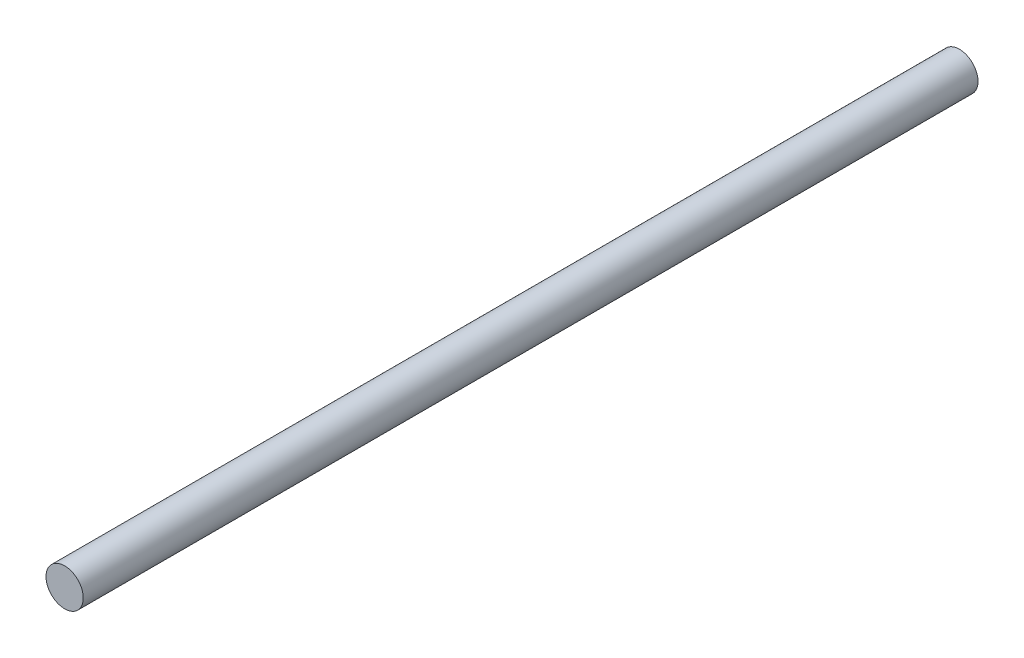
ISO-10303-21;
HEADER;
FILE_DESCRIPTION(('STEP AP214'),'2;1');
FILE_NAME('part.step','',(''),(''),'','','');
FILE_SCHEMA(('AUTOMOTIVE_DESIGN { 1 0 10303 214 1 1 1 1 }'));
ENDSEC;
DATA;
#1=APPLICATION_CONTEXT('core data for automotive mechanical design processes');
#2=APPLICATION_PROTOCOL_DEFINITION('international standard','automotive_design',2000,#1);
#3=PRODUCT_CONTEXT('',#1,'mechanical');
#4=PRODUCT('Part','Part','',(#3));
#5=PRODUCT_RELATED_PRODUCT_CATEGORY('part','',(#4));
#6=PRODUCT_DEFINITION_FORMATION('','',#4);
#7=PRODUCT_DEFINITION_CONTEXT('part definition',#1,'design');
#8=PRODUCT_DEFINITION('design','',#6,#7);
#9=PRODUCT_DEFINITION_SHAPE('','',#8);
#10=(LENGTH_UNIT() NAMED_UNIT(*) SI_UNIT(.MILLI.,.METRE.));
#11=(NAMED_UNIT(*) PLANE_ANGLE_UNIT() SI_UNIT($,.RADIAN.));
#12=(NAMED_UNIT(*) SI_UNIT($,.STERADIAN.) SOLID_ANGLE_UNIT());
#13=UNCERTAINTY_MEASURE_WITH_UNIT(LENGTH_MEASURE(1.E-05),#10,'distance_accuracy_value','');
#14=(GEOMETRIC_REPRESENTATION_CONTEXT(3) GLOBAL_UNCERTAINTY_ASSIGNED_CONTEXT((#13)) GLOBAL_UNIT_ASSIGNED_CONTEXT((#10,
#11,#12)) REPRESENTATION_CONTEXT('',''));
#15=CARTESIAN_POINT('',(0.,0.,0.));
#16=DIRECTION('',(0.,0.,1.));
#17=DIRECTION('',(1.,0.,0.));
#18=AXIS2_PLACEMENT_3D('',#15,#16,#17);
#19=CARTESIAN_POINT('',(0.,0.,152.4));
#20=DIRECTION('',(0.,0.,-1.));
#21=DIRECTION('',(-1.,0.,0.));
#22=AXIS2_PLACEMENT_3D('',#19,#20,#21);
#23=CYLINDRICAL_SURFACE('',#22,6.35);
#24=CARTESIAN_POINT('',(0.,0.,152.4));
#25=DIRECTION('',(0.,0.,1.));
#26=DIRECTION('',(1.,0.,0.));
#27=AXIS2_PLACEMENT_3D('',#24,#25,#26);
#28=CIRCLE('',#27,6.35);
#29=CARTESIAN_POINT('',(-6.35,0.,152.4));
#30=VERTEX_POINT('',#29);
#31=EDGE_CURVE('E10',#30,#30,#28,.T.);
#32=CARTESIAN_POINT('',(0.,0.,-152.4));
#33=DIRECTION('',(0.,0.,1.));
#34=DIRECTION('',(1.,0.,0.));
#35=AXIS2_PLACEMENT_3D('',#32,#33,#34);
#36=CIRCLE('',#35,6.35);
#37=CARTESIAN_POINT('',(-6.35,0.,-152.4));
#38=VERTEX_POINT('',#37);
#39=EDGE_CURVE('E34',#38,#38,#36,.T.);
#40=CARTESIAN_POINT('',(-6.35,0.,152.4));
#41=CARTESIAN_POINT('',(-6.35,0.,149.225));
#42=CARTESIAN_POINT('',(-6.35,0.,146.05));
#43=CARTESIAN_POINT('',(-6.35,0.,139.7));
#44=CARTESIAN_POINT('',(-6.35,0.,136.525));
#45=CARTESIAN_POINT('',(-6.35,0.,130.175));
#46=CARTESIAN_POINT('',(-6.35,0.,127.));
#47=CARTESIAN_POINT('',(-6.35,0.,120.65));
#48=CARTESIAN_POINT('',(-6.35,0.,117.475));
#49=CARTESIAN_POINT('',(-6.35,0.,111.125));
#50=CARTESIAN_POINT('',(-6.35,0.,107.95));
#51=CARTESIAN_POINT('',(-6.35,0.,101.6));
#52=CARTESIAN_POINT('',(-6.35,0.,98.425));
#53=CARTESIAN_POINT('',(-6.35,0.,92.075));
#54=CARTESIAN_POINT('',(-6.35,0.,88.9));
#55=CARTESIAN_POINT('',(-6.35,0.,82.55));
#56=CARTESIAN_POINT('',(-6.35,0.,79.375));
#57=CARTESIAN_POINT('',(-6.35,0.,73.025));
#58=CARTESIAN_POINT('',(-6.35,0.,69.85));
#59=CARTESIAN_POINT('',(-6.35,0.,63.5));
#60=CARTESIAN_POINT('',(-6.35,0.,60.325));
#61=CARTESIAN_POINT('',(-6.35,0.,53.975));
#62=CARTESIAN_POINT('',(-6.35,0.,50.8));
#63=CARTESIAN_POINT('',(-6.35,0.,44.45));
#64=CARTESIAN_POINT('',(-6.35,0.,41.275));
#65=CARTESIAN_POINT('',(-6.35,0.,34.925));
#66=CARTESIAN_POINT('',(-6.35,0.,31.75));
#67=CARTESIAN_POINT('',(-6.35,0.,25.4));
#68=CARTESIAN_POINT('',(-6.35,0.,22.225));
#69=CARTESIAN_POINT('',(-6.35,0.,15.875));
#70=CARTESIAN_POINT('',(-6.35,0.,12.7));
#71=CARTESIAN_POINT('',(-6.35,0.,6.35));
#72=CARTESIAN_POINT('',(-6.35,0.,3.175));
#73=CARTESIAN_POINT('',(-6.35,0.,-3.175));
#74=CARTESIAN_POINT('',(-6.35,0.,-6.35));
#75=CARTESIAN_POINT('',(-6.35,0.,-12.7));
#76=CARTESIAN_POINT('',(-6.35,0.,-15.875));
#77=CARTESIAN_POINT('',(-6.35,0.,-22.225));
#78=CARTESIAN_POINT('',(-6.35,0.,-25.4));
#79=CARTESIAN_POINT('',(-6.35,0.,-31.75));
#80=CARTESIAN_POINT('',(-6.35,0.,-34.925));
#81=CARTESIAN_POINT('',(-6.35,0.,-41.275));
#82=CARTESIAN_POINT('',(-6.35,0.,-44.45));
#83=CARTESIAN_POINT('',(-6.35,0.,-50.8));
#84=CARTESIAN_POINT('',(-6.35,0.,-53.975));
#85=CARTESIAN_POINT('',(-6.35,0.,-60.325));
#86=CARTESIAN_POINT('',(-6.35,0.,-63.5));
#87=CARTESIAN_POINT('',(-6.35,0.,-69.85));
#88=CARTESIAN_POINT('',(-6.35,0.,-73.025));
#89=CARTESIAN_POINT('',(-6.35,0.,-79.375));
#90=CARTESIAN_POINT('',(-6.35,0.,-82.55));
#91=CARTESIAN_POINT('',(-6.35,0.,-88.9));
#92=CARTESIAN_POINT('',(-6.35,0.,-92.075));
#93=CARTESIAN_POINT('',(-6.35,0.,-98.425));
#94=CARTESIAN_POINT('',(-6.35,0.,-101.6));
#95=CARTESIAN_POINT('',(-6.35,0.,-107.95));
#96=CARTESIAN_POINT('',(-6.35,0.,-111.125));
#97=CARTESIAN_POINT('',(-6.35,0.,-117.475));
#98=CARTESIAN_POINT('',(-6.35,0.,-120.65));
#99=CARTESIAN_POINT('',(-6.35,0.,-127.));
#100=CARTESIAN_POINT('',(-6.35,0.,-130.175));
#101=CARTESIAN_POINT('',(-6.35,0.,-136.525));
#102=CARTESIAN_POINT('',(-6.35,0.,-139.7));
#103=CARTESIAN_POINT('',(-6.35,0.,-146.05));
#104=CARTESIAN_POINT('',(-6.35,0.,-149.225));
#105=CARTESIAN_POINT('',(-6.35,0.,-152.4));
#106=B_SPLINE_CURVE_WITH_KNOTS('',3,(#40,#41,#42,#43,#44,#45,#46,#47,#48,#49,#50,#51,#52,#53,
#54,#55,#56,#57,#58,#59,#60,#61,#62,#63,#64,#65,#66,#67,#68,#69,#70,#71,#72,#73,#74,#75,#76,#77,
#78,#79,#80,#81,#82,#83,#84,#85,#86,#87,#88,#89,#90,#91,#92,#93,#94,#95,#96,#97,#98,#99,#100,
#101,#102,#103,#104,#105),.UNSPECIFIED.,.F.,.F.,(4,2,2,2,2,2,2,2,2,2,2,2,2,2,2,2,2,2,2,2,2,2,2,
2,2,2,2,2,2,2,2,2,4),(0.,9.52500000000001,19.05,28.575,38.1,47.625,57.15,66.675,76.2,85.725,
95.25,104.775,114.3,123.825,133.35,142.875,152.4,161.925,171.45,180.975,190.5,200.025,209.55,
219.075,228.6,238.125,247.65,257.175,266.7,276.225,285.75,295.275,304.8),.UNSPECIFIED.);
#107=EDGE_CURVE('BSEAM31',#30,#38,#106,.T.);
#108=ORIENTED_EDGE('',*,*,#31,.F.);
#109=ORIENTED_EDGE('',*,*,#39,.T.);
#110=ORIENTED_EDGE('',*,*,#107,.T.);
#111=ORIENTED_EDGE('',*,*,#107,.F.);
#112=EDGE_LOOP('',(#108,#110,#109,#111));
#113=FACE_BOUND('',#112,.T.);
#114=ADVANCED_FACE('F31',(#113),#23,.T.);
#115=CARTESIAN_POINT('',(0.,0.,152.4));
#116=DIRECTION('',(0.,0.,1.));
#117=DIRECTION('',(1.,0.,0.));
#118=AXIS2_PLACEMENT_3D('',#115,#116,#117);
#119=PLANE('',#118);
#120=ORIENTED_EDGE('',*,*,#31,.T.);
#121=EDGE_LOOP('',(#120));
#122=FACE_BOUND('',#121,.T.);
#123=ADVANCED_FACE('F46',(#122),#119,.T.);
#124=CARTESIAN_POINT('',(0.,0.,-152.4));
#125=DIRECTION('',(0.,0.,1.));
#126=DIRECTION('',(1.,0.,0.));
#127=AXIS2_PLACEMENT_3D('',#124,#125,#126);
#128=PLANE('',#127);
#129=ORIENTED_EDGE('',*,*,#39,.F.);
#130=EDGE_LOOP('',(#129));
#131=FACE_BOUND('',#130,.T.);
#132=ADVANCED_FACE('F44',(#131),#128,.F.);
#133=CLOSED_SHELL('',(#114,#123,#132));
#134=MANIFOLD_SOLID_BREP('B2',#133);
#135=ADVANCED_BREP_SHAPE_REPRESENTATION('',(#18,#134),#14);
#136=SHAPE_DEFINITION_REPRESENTATION(#9,#135);
ENDSEC;
END-ISO-10303-21;
